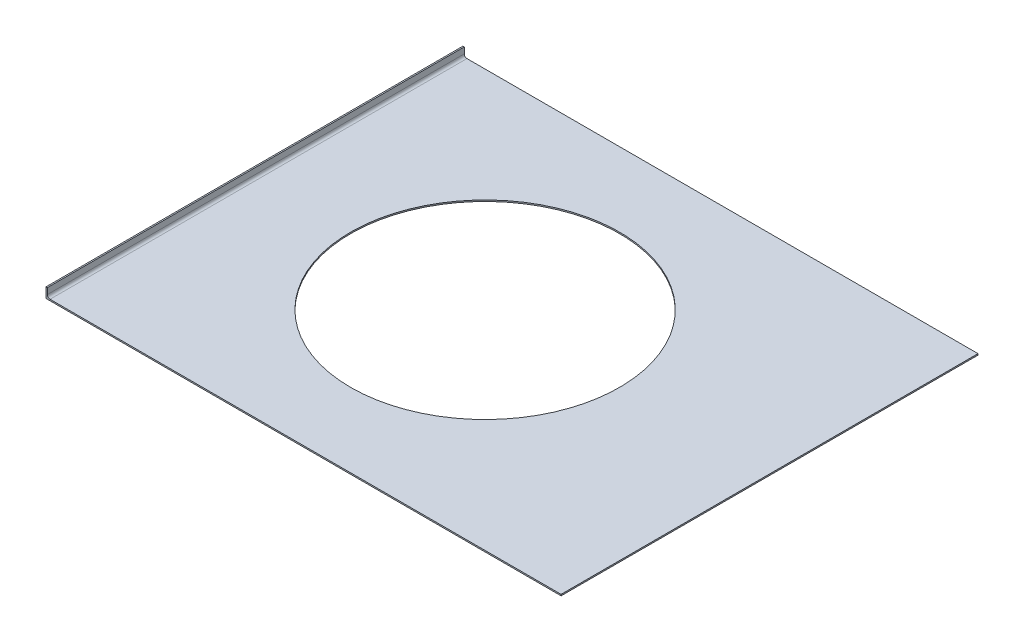
ISO-10303-21;
HEADER;
FILE_DESCRIPTION(('STEP AP214'),'2;1');
FILE_NAME('part.step','',(''),(''),'','','');
FILE_SCHEMA(('AUTOMOTIVE_DESIGN { 1 0 10303 214 1 1 1 1 }'));
ENDSEC;
DATA;
#1=APPLICATION_CONTEXT('core data for automotive mechanical design processes');
#2=APPLICATION_PROTOCOL_DEFINITION('international standard','automotive_design',2000,#1);
#3=PRODUCT_CONTEXT('',#1,'mechanical');
#4=PRODUCT('Part','Part','',(#3));
#5=PRODUCT_RELATED_PRODUCT_CATEGORY('part','',(#4));
#6=PRODUCT_DEFINITION_FORMATION('','',#4);
#7=PRODUCT_DEFINITION_CONTEXT('part definition',#1,'design');
#8=PRODUCT_DEFINITION('design','',#6,#7);
#9=PRODUCT_DEFINITION_SHAPE('','',#8);
#10=(LENGTH_UNIT() NAMED_UNIT(*) SI_UNIT(.MILLI.,.METRE.));
#11=(NAMED_UNIT(*) PLANE_ANGLE_UNIT() SI_UNIT($,.RADIAN.));
#12=(NAMED_UNIT(*) SI_UNIT($,.STERADIAN.) SOLID_ANGLE_UNIT());
#13=UNCERTAINTY_MEASURE_WITH_UNIT(LENGTH_MEASURE(1.E-05),#10,'distance_accuracy_value','');
#14=(GEOMETRIC_REPRESENTATION_CONTEXT(3) GLOBAL_UNCERTAINTY_ASSIGNED_CONTEXT((#13)) GLOBAL_UNIT_ASSIGNED_CONTEXT((#10,
#11,#12)) REPRESENTATION_CONTEXT('',''));
#15=CARTESIAN_POINT('',(0.,0.,0.));
#16=DIRECTION('',(0.,0.,1.));
#17=DIRECTION('',(1.,0.,0.));
#18=AXIS2_PLACEMENT_3D('',#15,#16,#17);
#19=CARTESIAN_POINT('',(0.,0.634999999999997,0.));
#20=DIRECTION('',(0.,-1.,0.));
#21=DIRECTION('',(0.,0.,-1.));
#22=AXIS2_PLACEMENT_3D('',#19,#20,#21);
#23=PLANE('',#22);
#24=CARTESIAN_POINT('',(-25.4,0.634999999999997,0.));
#25=DIRECTION('',(0.,1.,0.));
#26=DIRECTION('',(0.,0.,1.));
#27=AXIS2_PLACEMENT_3D('',#24,#25,#26);
#28=CIRCLE('',#27,127.);
#29=CARTESIAN_POINT('',(-25.4,0.635000000006088,127.));
#30=VERTEX_POINT('',#29);
#31=EDGE_CURVE('E121',#30,#30,#28,.T.);
#32=ORIENTED_EDGE('',*,*,#31,.F.);
#33=EDGE_LOOP('',(#32));
#34=FACE_BOUND('',#33,.T.);
#35=DIRECTION('',(-1.,0.,0.));
#36=VECTOR('',#35,1.);
#37=CARTESIAN_POINT('',(243.205,0.634999999990678,-196.85));
#38=LINE('',#37,#36);
#39=CARTESIAN_POINT('',(243.205,0.634999999990678,-196.85));
#40=VERTEX_POINT('',#39);
#41=CARTESIAN_POINT('',(-239.395,0.634999999990678,-196.85));
#42=VERTEX_POINT('',#41);
#43=EDGE_CURVE('E135',#40,#42,#38,.T.);
#44=ORIENTED_EDGE('',*,*,#43,.T.);
#45=DIRECTION('',(0.,0.,-1.));
#46=VECTOR('',#45,1.);
#47=CARTESIAN_POINT('',(-239.395,0.635000000009656,196.849999999998));
#48=LINE('',#47,#46);
#49=CARTESIAN_POINT('',(-239.395,0.635000000009656,196.849999999998));
#50=VERTEX_POINT('',#49);
#51=EDGE_CURVE('E57',#42,#50,#48,.F.);
#52=ORIENTED_EDGE('',*,*,#51,.T.);
#53=DIRECTION('',(1.,0.,0.));
#54=VECTOR('',#53,1.);
#55=CARTESIAN_POINT('',(243.205,0.635000000009329,196.849999999998));
#56=LINE('',#55,#54);
#57=CARTESIAN_POINT('',(243.205,0.635000000009329,196.849999999998));
#58=VERTEX_POINT('',#57);
#59=EDGE_CURVE('E130',#50,#58,#56,.T.);
#60=ORIENTED_EDGE('',*,*,#59,.T.);
#61=DIRECTION('',(0.,0.,-1.));
#62=VECTOR('',#61,1.);
#63=CARTESIAN_POINT('',(243.205,0.634999999990678,-196.85));
#64=LINE('',#63,#62);
#65=EDGE_CURVE('E132',#58,#40,#64,.T.);
#66=ORIENTED_EDGE('',*,*,#65,.T.);
#67=EDGE_LOOP('',(#44,#52,#60,#66));
#68=FACE_BOUND('',#67,.T.);
#69=ADVANCED_FACE('F36',(#34,#68),#23,.F.);
#70=CARTESIAN_POINT('',(-243.205,0.634999999990941,-196.85));
#71=DIRECTION('',(1.,0.,0.));
#72=DIRECTION('',(0.,0.,-1.));
#73=AXIS2_PLACEMENT_3D('',#70,#71,#72);
#74=PLANE('',#73);
#75=DIRECTION('',(0.,0.,1.));
#76=VECTOR('',#75,1.);
#77=CARTESIAN_POINT('',(-243.205,-0.635000000009059,-196.85));
#78=LINE('',#77,#76);
#79=CARTESIAN_POINT('',(-243.205,-0.635000000009059,-196.85));
#80=VERTEX_POINT('',#79);
#81=CARTESIAN_POINT('',(-243.205,-0.634999999990407,196.849999999998));
#82=VERTEX_POINT('',#81);
#83=EDGE_CURVE('E127',#80,#82,#78,.T.);
#84=ORIENTED_EDGE('',*,*,#83,.T.);
#85=DIRECTION('',(0.,-1.,0.));
#86=VECTOR('',#85,1.);
#87=CARTESIAN_POINT('',(-243.205,0.635000000009593,196.849999999998));
#88=LINE('',#87,#86);
#89=CARTESIAN_POINT('',(-243.205,8.89000000000998,196.85));
#90=VERTEX_POINT('',#89);
#91=EDGE_CURVE('E151',#90,#82,#88,.T.);
#92=ORIENTED_EDGE('',*,*,#91,.F.);
#93=DIRECTION('',(0.,0.,-1.));
#94=VECTOR('',#93,1.);
#95=CARTESIAN_POINT('',(-243.205,8.89000000001059,206.459293678518));
#96=LINE('',#95,#94);
#97=CARTESIAN_POINT('',(-243.205,8.88999999999069,-196.85));
#98=VERTEX_POINT('',#97);
#99=EDGE_CURVE('E105',#90,#98,#96,.T.);
#100=ORIENTED_EDGE('',*,*,#99,.T.);
#101=DIRECTION('',(0.,-1.,0.));
#102=VECTOR('',#101,1.);
#103=CARTESIAN_POINT('',(-243.205,0.634999999990941,-196.85));
#104=LINE('',#103,#102);
#105=EDGE_CURVE('E110',#98,#80,#104,.T.);
#106=ORIENTED_EDGE('',*,*,#105,.T.);
#107=EDGE_LOOP('',(#84,#92,#100,#106));
#108=FACE_BOUND('',#107,.T.);
#109=ADVANCED_FACE('F160',(#108),#74,.F.);
#110=CARTESIAN_POINT('',(243.205,0.635000000009329,196.849999999998));
#111=DIRECTION('',(0.,0.,-1.));
#112=DIRECTION('',(-1.,0.,0.));
#113=AXIS2_PLACEMENT_3D('',#110,#111,#112);
#114=PLANE('',#113);
#115=DIRECTION('',(1.,0.,0.));
#116=VECTOR('',#115,1.);
#117=CARTESIAN_POINT('',(243.204999999997,-0.634999999990671,196.849999999998));
#118=LINE('',#117,#116);
#119=CARTESIAN_POINT('',(243.204999999997,-0.634999999990671,196.849999999998));
#120=VERTEX_POINT('',#119);
#121=EDGE_CURVE('E139',#82,#120,#118,.T.);
#122=ORIENTED_EDGE('',*,*,#121,.T.);
#123=DIRECTION('',(0.,-1.,0.));
#124=VECTOR('',#123,1.);
#125=CARTESIAN_POINT('',(243.205,0.635000000009329,196.849999999998));
#126=LINE('',#125,#124);
#127=EDGE_CURVE('E148',#58,#120,#126,.T.);
#128=ORIENTED_EDGE('',*,*,#127,.F.);
#129=ORIENTED_EDGE('',*,*,#59,.F.);
#130=CARTESIAN_POINT('',(-239.395,3.17500000000934,196.85));
#131=DIRECTION('',(0.,0.,-1.));
#132=DIRECTION('',(-1.,0.,0.));
#133=AXIS2_PLACEMENT_3D('',#130,#131,#132);
#134=CIRCLE('',#133,2.54);
#135=CARTESIAN_POINT('',(-241.935,3.17500000001001,196.85));
#136=VERTEX_POINT('',#135);
#137=EDGE_CURVE('E11',#50,#136,#134,.T.);
#138=ORIENTED_EDGE('',*,*,#137,.T.);
#139=DIRECTION('',(0.,-1.,0.));
#140=VECTOR('',#139,1.);
#141=CARTESIAN_POINT('',(-241.935,-0.634999999990671,196.849999999998));
#142=LINE('',#141,#140);
#143=CARTESIAN_POINT('',(-241.935,8.89000000000999,196.85));
#144=VERTEX_POINT('',#143);
#145=EDGE_CURVE('E119',#144,#136,#142,.T.);
#146=ORIENTED_EDGE('',*,*,#145,.F.);
#147=DIRECTION('',(1.,0.,0.));
#148=VECTOR('',#147,1.);
#149=CARTESIAN_POINT('',(-243.205,8.89000000000998,196.85));
#150=LINE('',#149,#148);
#151=EDGE_CURVE('E101',#90,#144,#150,.T.);
#152=ORIENTED_EDGE('',*,*,#151,.F.);
#153=ORIENTED_EDGE('',*,*,#91,.T.);
#154=EDGE_LOOP('',(#122,#128,#129,#138,#146,#152,#153));
#155=FACE_BOUND('',#154,.T.);
#156=ADVANCED_FACE('F156',(#155),#114,.F.);
#157=CARTESIAN_POINT('',(243.205,0.634999999990678,-196.85));
#158=DIRECTION('',(-1.,0.,0.));
#159=DIRECTION('',(0.,0.,1.));
#160=AXIS2_PLACEMENT_3D('',#157,#158,#159);
#161=PLANE('',#160);
#162=DIRECTION('',(0.,0.,-1.));
#163=VECTOR('',#162,1.);
#164=CARTESIAN_POINT('',(243.204999999997,-0.635000000009323,-196.85));
#165=LINE('',#164,#163);
#166=CARTESIAN_POINT('',(243.204999999997,-0.635000000009323,-196.85));
#167=VERTEX_POINT('',#166);
#168=EDGE_CURVE('E141',#120,#167,#165,.T.);
#169=ORIENTED_EDGE('',*,*,#168,.T.);
#170=DIRECTION('',(0.,-1.,0.));
#171=VECTOR('',#170,1.);
#172=CARTESIAN_POINT('',(243.205,0.634999999990678,-196.85));
#173=LINE('',#172,#171);
#174=EDGE_CURVE('E145',#40,#167,#173,.T.);
#175=ORIENTED_EDGE('',*,*,#174,.F.);
#176=ORIENTED_EDGE('',*,*,#65,.F.);
#177=ORIENTED_EDGE('',*,*,#127,.T.);
#178=EDGE_LOOP('',(#169,#175,#176,#177));
#179=FACE_BOUND('',#178,.T.);
#180=ADVANCED_FACE('F168',(#179),#161,.F.);
#181=CARTESIAN_POINT('',(243.205,0.634999999990678,-196.85));
#182=DIRECTION('',(0.,0.,1.));
#183=DIRECTION('',(1.,0.,0.));
#184=AXIS2_PLACEMENT_3D('',#181,#182,#183);
#185=PLANE('',#184);
#186=ORIENTED_EDGE('',*,*,#105,.F.);
#187=DIRECTION('',(1.,0.,0.));
#188=VECTOR('',#187,1.);
#189=CARTESIAN_POINT('',(-243.205,8.88999999999069,-196.85));
#190=LINE('',#189,#188);
#191=CARTESIAN_POINT('',(-241.935,8.88999999999075,-196.85));
#192=VERTEX_POINT('',#191);
#193=EDGE_CURVE('E99',#98,#192,#190,.T.);
#194=ORIENTED_EDGE('',*,*,#193,.T.);
#195=DIRECTION('',(0.,-1.,0.));
#196=VECTOR('',#195,1.);
#197=CARTESIAN_POINT('',(-241.935,-0.635000000009329,-196.85));
#198=LINE('',#197,#196);
#199=CARTESIAN_POINT('',(-241.935,3.17499999999069,-196.85));
#200=VERTEX_POINT('',#199);
#201=EDGE_CURVE('E108',#192,#200,#198,.T.);
#202=ORIENTED_EDGE('',*,*,#201,.T.);
#203=CARTESIAN_POINT('',(-239.395,3.17499999999065,-196.85));
#204=DIRECTION('',(0.,0.,1.));
#205=DIRECTION('',(1.,0.,0.));
#206=AXIS2_PLACEMENT_3D('',#203,#204,#205);
#207=CIRCLE('',#206,2.54);
#208=EDGE_CURVE('E44',#200,#42,#207,.T.);
#209=ORIENTED_EDGE('',*,*,#208,.T.);
#210=ORIENTED_EDGE('',*,*,#43,.F.);
#211=ORIENTED_EDGE('',*,*,#174,.T.);
#212=DIRECTION('',(-1.,0.,0.));
#213=VECTOR('',#212,1.);
#214=CARTESIAN_POINT('',(243.204999999997,-0.635000000009323,-196.85));
#215=LINE('',#214,#213);
#216=EDGE_CURVE('E133',#167,#80,#215,.T.);
#217=ORIENTED_EDGE('',*,*,#216,.T.);
#218=EDGE_LOOP('',(#186,#194,#202,#209,#210,#211,#217));
#219=FACE_BOUND('',#218,.T.);
#220=ADVANCED_FACE('F107',(#219),#185,.F.);
#221=CARTESIAN_POINT('',(0.,-0.634999999999997,-6.66133814775094E-13));
#222=DIRECTION('',(0.,-1.,0.));
#223=DIRECTION('',(0.,0.,-1.));
#224=AXIS2_PLACEMENT_3D('',#221,#222,#223);
#225=PLANE('',#224);
#226=ORIENTED_EDGE('',*,*,#83,.F.);
#227=ORIENTED_EDGE('',*,*,#216,.F.);
#228=ORIENTED_EDGE('',*,*,#168,.F.);
#229=ORIENTED_EDGE('',*,*,#121,.F.);
#230=EDGE_LOOP('',(#226,#227,#228,#229));
#231=FACE_BOUND('',#230,.T.);
#232=CARTESIAN_POINT('',(-25.4,-0.635000000000004,-6.66133814775094E-13));
#233=DIRECTION('',(0.,1.,0.));
#234=DIRECTION('',(0.,0.,1.));
#235=AXIS2_PLACEMENT_3D('',#232,#233,#234);
#236=CIRCLE('',#235,127.);
#237=CARTESIAN_POINT('',(-25.4,-0.634999999993912,126.999999999999));
#238=VERTEX_POINT('',#237);
#239=EDGE_CURVE('E124',#238,#238,#236,.T.);
#240=ORIENTED_EDGE('',*,*,#239,.T.);
#241=EDGE_LOOP('',(#240));
#242=FACE_BOUND('',#241,.T.);
#243=ADVANCED_FACE('F163',(#231,#242),#225,.T.);
#244=CARTESIAN_POINT('',(-25.4,-0.635000000000004,-6.66133814775094E-13));
#245=DIRECTION('',(0.,1.,0.));
#246=DIRECTION('',(0.,0.,1.));
#247=AXIS2_PLACEMENT_3D('',#244,#245,#246);
#248=CYLINDRICAL_SURFACE('',#247,127.);
#249=ORIENTED_EDGE('',*,*,#239,.F.);
#250=EDGE_LOOP('',(#249));
#251=FACE_BOUND('',#250,.T.);
#252=ORIENTED_EDGE('',*,*,#31,.T.);
#253=EDGE_LOOP('',(#252));
#254=FACE_BOUND('',#253,.T.);
#255=ADVANCED_FACE('F186',(#251,#254),#248,.F.);
#256=CARTESIAN_POINT('',(-241.935,-0.634999999990338,206.459293678515));
#257=DIRECTION('',(-1.,0.,0.));
#258=DIRECTION('',(0.,0.,1.));
#259=AXIS2_PLACEMENT_3D('',#256,#257,#258);
#260=PLANE('',#259);
#261=ORIENTED_EDGE('',*,*,#145,.T.);
#262=DIRECTION('',(0.,0.,-1.));
#263=VECTOR('',#262,1.);
#264=CARTESIAN_POINT('',(-241.935,3.17499999999069,-196.85));
#265=LINE('',#264,#263);
#266=EDGE_CURVE('E116',#136,#200,#265,.T.);
#267=ORIENTED_EDGE('',*,*,#266,.T.);
#268=ORIENTED_EDGE('',*,*,#201,.F.);
#269=DIRECTION('',(0.,0.,-1.));
#270=VECTOR('',#269,1.);
#271=CARTESIAN_POINT('',(-241.935,8.89000000001063,206.459293678518));
#272=LINE('',#271,#270);
#273=EDGE_CURVE('E95',#144,#192,#272,.T.);
#274=ORIENTED_EDGE('',*,*,#273,.F.);
#275=EDGE_LOOP('',(#261,#267,#268,#274));
#276=FACE_BOUND('',#275,.T.);
#277=ADVANCED_FACE('F114',(#276),#260,.F.);
#278=CARTESIAN_POINT('',(-243.205,8.89000000001059,206.459293678518));
#279=DIRECTION('',(0.,-1.,0.));
#280=DIRECTION('',(0.,0.,-1.));
#281=AXIS2_PLACEMENT_3D('',#278,#279,#280);
#282=PLANE('',#281);
#283=ORIENTED_EDGE('',*,*,#99,.F.);
#284=ORIENTED_EDGE('',*,*,#151,.T.);
#285=ORIENTED_EDGE('',*,*,#273,.T.);
#286=ORIENTED_EDGE('',*,*,#193,.F.);
#287=EDGE_LOOP('',(#283,#284,#285,#286));
#288=FACE_BOUND('',#287,.T.);
#289=ADVANCED_FACE('F98',(#288),#282,.F.);
#290=CARTESIAN_POINT('',(-239.395,3.17500000000998,206.459293678518));
#291=DIRECTION('',(0.,0.,1.));
#292=DIRECTION('',(1.,0.,0.));
#293=AXIS2_PLACEMENT_3D('',#290,#291,#292);
#294=CYLINDRICAL_SURFACE('',#293,2.54);
#295=ORIENTED_EDGE('',*,*,#137,.F.);
#296=ORIENTED_EDGE('',*,*,#51,.F.);
#297=ORIENTED_EDGE('',*,*,#208,.F.);
#298=ORIENTED_EDGE('',*,*,#266,.F.);
#299=EDGE_LOOP('',(#295,#296,#297,#298));
#300=FACE_BOUND('',#299,.T.);
#301=ADVANCED_FACE('F38',(#300),#294,.F.);
#302=CLOSED_SHELL('',(#69,#109,#156,#180,#220,#243,#255,#277,#289,#301));
#303=MANIFOLD_SOLID_BREP('B2',#302);
#304=ADVANCED_BREP_SHAPE_REPRESENTATION('',(#18,#303),#14);
#305=SHAPE_DEFINITION_REPRESENTATION(#9,#304);
ENDSEC;
END-ISO-10303-21;
